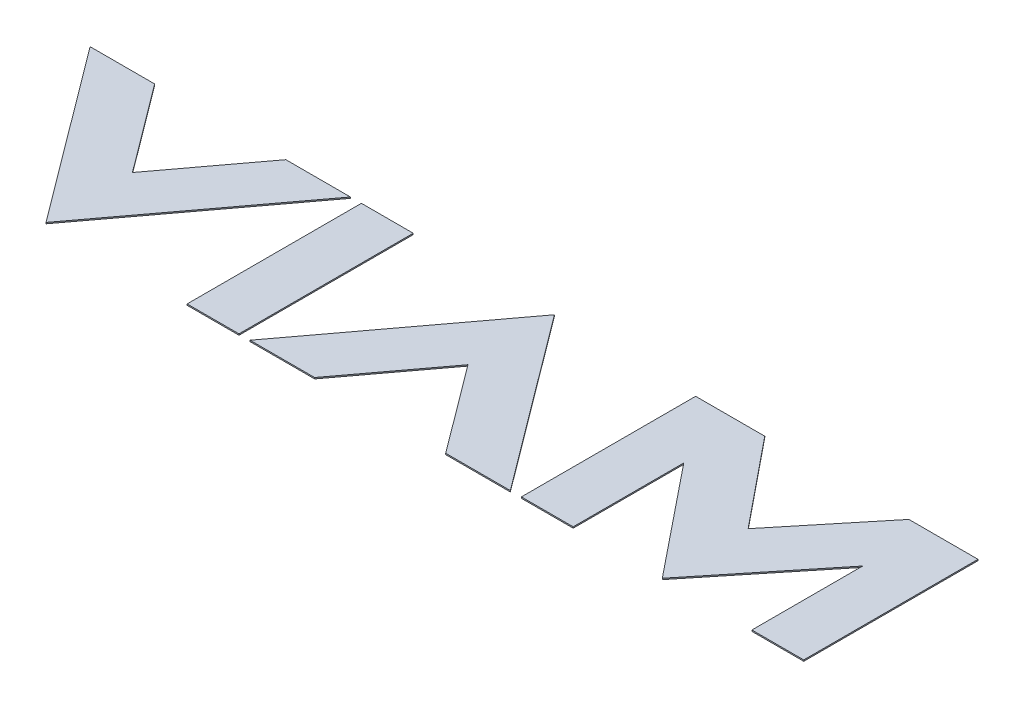
ISO-10303-21;
HEADER;
FILE_DESCRIPTION(('STEP AP214'),'2;1');
FILE_NAME('part.step','',(''),(''),'','','');
FILE_SCHEMA(('AUTOMOTIVE_DESIGN { 1 0 10303 214 1 1 1 1 }'));
ENDSEC;
DATA;
#1=APPLICATION_CONTEXT('core data for automotive mechanical design processes');
#2=APPLICATION_PROTOCOL_DEFINITION('international standard','automotive_design',2000,#1);
#3=PRODUCT_CONTEXT('',#1,'mechanical');
#4=PRODUCT('Part','Part','',(#3));
#5=PRODUCT_RELATED_PRODUCT_CATEGORY('part','',(#4));
#6=PRODUCT_DEFINITION_FORMATION('','',#4);
#7=PRODUCT_DEFINITION_CONTEXT('part definition',#1,'design');
#8=PRODUCT_DEFINITION('design','',#6,#7);
#9=PRODUCT_DEFINITION_SHAPE('','',#8);
#10=(LENGTH_UNIT() NAMED_UNIT(*) SI_UNIT(.MILLI.,.METRE.));
#11=(NAMED_UNIT(*) PLANE_ANGLE_UNIT() SI_UNIT($,.RADIAN.));
#12=(NAMED_UNIT(*) SI_UNIT($,.STERADIAN.) SOLID_ANGLE_UNIT());
#13=UNCERTAINTY_MEASURE_WITH_UNIT(LENGTH_MEASURE(1.E-05),#10,'distance_accuracy_value','');
#14=(GEOMETRIC_REPRESENTATION_CONTEXT(3) GLOBAL_UNCERTAINTY_ASSIGNED_CONTEXT((#13)) GLOBAL_UNIT_ASSIGNED_CONTEXT((#10,
#11,#12)) REPRESENTATION_CONTEXT('',''));
#15=CARTESIAN_POINT('',(0.,0.,0.));
#16=DIRECTION('',(0.,0.,1.));
#17=DIRECTION('',(1.,0.,0.));
#18=AXIS2_PLACEMENT_3D('',#15,#16,#17);
#19=CARTESIAN_POINT('',(11.7883153656796,0.1,6.73885035664306));
#20=DIRECTION('',(-0.801244842844147,0.,0.598336612464638));
#21=DIRECTION('',(0.598336612464638,0.,0.801244842844147));
#22=AXIS2_PLACEMENT_3D('',#19,#20,#21);
#23=PLANE('',#22);
#24=DIRECTION('',(-0.598336612464638,0.,-0.801244842844147));
#25=VECTOR('',#24,1.);
#26=CARTESIAN_POINT('',(11.7883153656796,0.,6.73885035664306));
#27=LINE('',#26,#25);
#28=CARTESIAN_POINT('',(11.7883153656796,0.,6.73885035664306));
#29=VERTEX_POINT('',#28);
#30=CARTESIAN_POINT('',(1.31660656567958,0.,-7.28402990335696));
#31=VERTEX_POINT('',#30);
#32=EDGE_CURVE('E144',#29,#31,#27,.T.);
#33=ORIENTED_EDGE('',*,*,#32,.T.);
#34=DIRECTION('',(0.,-1.,0.));
#35=VECTOR('',#34,1.);
#36=CARTESIAN_POINT('',(1.31660656567958,0.1,-7.28402990335696));
#37=LINE('',#36,#35);
#38=CARTESIAN_POINT('',(1.31660656567958,0.1,-7.28402990335696));
#39=VERTEX_POINT('',#38);
#40=EDGE_CURVE('E12',#39,#31,#37,.T.);
#41=ORIENTED_EDGE('',*,*,#40,.F.);
#42=DIRECTION('',(-0.598336612464638,0.,-0.801244842844147));
#43=VECTOR('',#42,1.);
#44=CARTESIAN_POINT('',(11.7883153656796,0.1,6.73885035664306));
#45=LINE('',#44,#43);
#46=CARTESIAN_POINT('',(11.7883153656796,0.1,6.73885035664306));
#47=VERTEX_POINT('',#46);
#48=EDGE_CURVE('E156',#47,#39,#45,.T.);
#49=ORIENTED_EDGE('',*,*,#48,.F.);
#50=DIRECTION('',(0.,-1.,0.));
#51=VECTOR('',#50,1.);
#52=CARTESIAN_POINT('',(11.7883153656796,0.1,6.73885035664306));
#53=LINE('',#52,#51);
#54=EDGE_CURVE('E140',#47,#29,#53,.T.);
#55=ORIENTED_EDGE('',*,*,#54,.T.);
#56=EDGE_LOOP('',(#33,#41,#49,#55));
#57=FACE_BOUND('',#56,.T.);
#58=ADVANCED_FACE('F49',(#57),#23,.F.);
#59=CARTESIAN_POINT('',(1.31660656567958,0.1,-7.28402990335696));
#60=DIRECTION('',(0.801160335078263,0.,0.598449761882553));
#61=DIRECTION('',(0.598449761882553,0.,-0.801160335078263));
#62=AXIS2_PLACEMENT_3D('',#59,#60,#61);
#63=PLANE('',#62);
#64=DIRECTION('',(-0.598449761882553,0.,0.801160335078263));
#65=VECTOR('',#64,1.);
#66=CARTESIAN_POINT('',(1.31660656567958,0.,-7.28402990335696));
#67=LINE('',#66,#65);
#68=CARTESIAN_POINT('',(-9.15510223432043,0.,6.73472031664306));
#69=VERTEX_POINT('',#68);
#70=EDGE_CURVE('E147',#31,#69,#67,.T.);
#71=ORIENTED_EDGE('',*,*,#70,.T.);
#72=DIRECTION('',(0.,-1.,0.));
#73=VECTOR('',#72,1.);
#74=CARTESIAN_POINT('',(-9.15510223432043,0.1,6.73472031664306));
#75=LINE('',#74,#73);
#76=CARTESIAN_POINT('',(-9.15510223432043,0.1,6.73472031664306));
#77=VERTEX_POINT('',#76);
#78=EDGE_CURVE('E57',#77,#69,#75,.T.);
#79=ORIENTED_EDGE('',*,*,#78,.F.);
#80=DIRECTION('',(-0.598449761882553,0.,0.801160335078263));
#81=VECTOR('',#80,1.);
#82=CARTESIAN_POINT('',(1.31660656567958,0.1,-7.28402990335696));
#83=LINE('',#82,#81);
#84=EDGE_CURVE('E105',#39,#77,#83,.T.);
#85=ORIENTED_EDGE('',*,*,#84,.F.);
#86=ORIENTED_EDGE('',*,*,#40,.T.);
#87=EDGE_LOOP('',(#71,#79,#85,#86));
#88=FACE_BOUND('',#87,.T.);
#89=ADVANCED_FACE('F183',(#88),#63,.F.);
#90=CARTESIAN_POINT('',(-9.15510223432043,0.1,6.73472031664306));
#91=DIRECTION('',(0.,0.,-1.));
#92=DIRECTION('',(-1.,0.,0.));
#93=AXIS2_PLACEMENT_3D('',#90,#91,#92);
#94=PLANE('',#93);
#95=DIRECTION('',(1.,0.,0.));
#96=VECTOR('',#95,1.);
#97=CARTESIAN_POINT('',(-9.15510223432043,0.,6.73472031664306));
#98=LINE('',#97,#96);
#99=CARTESIAN_POINT('',(-3.95856703432044,0.,6.73472031664306));
#100=VERTEX_POINT('',#99);
#101=EDGE_CURVE('E149',#69,#100,#98,.T.);
#102=ORIENTED_EDGE('',*,*,#101,.T.);
#103=DIRECTION('',(0.,-1.,0.));
#104=VECTOR('',#103,1.);
#105=CARTESIAN_POINT('',(-3.95856703432044,0.1,6.73472031664306));
#106=LINE('',#105,#104);
#107=CARTESIAN_POINT('',(-3.95856703432044,0.1,6.73472031664306));
#108=VERTEX_POINT('',#107);
#109=EDGE_CURVE('E132',#108,#100,#106,.T.);
#110=ORIENTED_EDGE('',*,*,#109,.F.);
#111=DIRECTION('',(1.,0.,0.));
#112=VECTOR('',#111,1.);
#113=CARTESIAN_POINT('',(-9.15510223432043,0.1,6.73472031664306));
#114=LINE('',#113,#112);
#115=EDGE_CURVE('E121',#77,#108,#114,.T.);
#116=ORIENTED_EDGE('',*,*,#115,.F.);
#117=ORIENTED_EDGE('',*,*,#78,.T.);
#118=EDGE_LOOP('',(#102,#110,#116,#117));
#119=FACE_BOUND('',#118,.T.);
#120=ADVANCED_FACE('F165',(#119),#94,.F.);
#121=CARTESIAN_POINT('',(-3.95856703432044,0.1,6.73472031664306));
#122=DIRECTION('',(-0.801122457843259,0.,-0.598500465780249));
#123=DIRECTION('',(-0.598500465780249,0.,0.801122457843259));
#124=AXIS2_PLACEMENT_3D('',#121,#122,#123);
#125=PLANE('',#124);
#126=DIRECTION('',(0.598500465780249,0.,-0.801122457843259));
#127=VECTOR('',#126,1.);
#128=CARTESIAN_POINT('',(-3.95856703432044,0.,6.73472031664306));
#129=LINE('',#128,#127);
#130=CARTESIAN_POINT('',(1.31660656567958,0.,-0.326360303356931));
#131=VERTEX_POINT('',#130);
#132=EDGE_CURVE('E130',#100,#131,#129,.T.);
#133=ORIENTED_EDGE('',*,*,#132,.T.);
#134=DIRECTION('',(0.,-1.,0.));
#135=VECTOR('',#134,1.);
#136=CARTESIAN_POINT('',(1.31660656567958,0.1,-0.326360303356931));
#137=LINE('',#136,#135);
#138=CARTESIAN_POINT('',(1.31660656567958,0.1,-0.326360303356931));
#139=VERTEX_POINT('',#138);
#140=EDGE_CURVE('E127',#139,#131,#137,.T.);
#141=ORIENTED_EDGE('',*,*,#140,.F.);
#142=DIRECTION('',(0.598500465780249,0.,-0.801122457843259));
#143=VECTOR('',#142,1.);
#144=CARTESIAN_POINT('',(-3.95856703432044,0.1,6.73472031664306));
#145=LINE('',#144,#143);
#146=EDGE_CURVE('E115',#108,#139,#145,.T.);
#147=ORIENTED_EDGE('',*,*,#146,.F.);
#148=ORIENTED_EDGE('',*,*,#109,.T.);
#149=EDGE_LOOP('',(#133,#141,#147,#148));
#150=FACE_BOUND('',#149,.T.);
#151=ADVANCED_FACE('F128',(#150),#125,.F.);
#152=CARTESIAN_POINT('',(1.31660656567958,0.1,-0.326360303356931));
#153=DIRECTION('',(0.801290209366539,0.,-0.598275856418532));
#154=DIRECTION('',(-0.598275856418532,0.,-0.801290209366539));
#155=AXIS2_PLACEMENT_3D('',#152,#153,#154);
#156=PLANE('',#155);
#157=DIRECTION('',(0.598275856418532,0.,0.801290209366539));
#158=VECTOR('',#157,1.);
#159=CARTESIAN_POINT('',(1.31660656567958,0.,-0.326360303356931));
#160=LINE('',#159,#158);
#161=CARTESIAN_POINT('',(6.59178016567957,0.,6.73885035664306));
#162=VERTEX_POINT('',#161);
#163=EDGE_CURVE('E91',#131,#162,#160,.T.);
#164=ORIENTED_EDGE('',*,*,#163,.T.);
#165=DIRECTION('',(0.,-1.,0.));
#166=VECTOR('',#165,1.);
#167=CARTESIAN_POINT('',(6.59178016567957,0.1,6.73885035664306));
#168=LINE('',#167,#166);
#169=CARTESIAN_POINT('',(6.59178016567957,0.1,6.73885035664306));
#170=VERTEX_POINT('',#169);
#171=EDGE_CURVE('E133',#170,#162,#168,.T.);
#172=ORIENTED_EDGE('',*,*,#171,.F.);
#173=DIRECTION('',(0.598275856418532,0.,0.801290209366539));
#174=VECTOR('',#173,1.);
#175=CARTESIAN_POINT('',(1.31660656567958,0.1,-0.326360303356931));
#176=LINE('',#175,#174);
#177=EDGE_CURVE('E119',#139,#170,#176,.T.);
#178=ORIENTED_EDGE('',*,*,#177,.F.);
#179=ORIENTED_EDGE('',*,*,#140,.T.);
#180=EDGE_LOOP('',(#164,#172,#178,#179));
#181=FACE_BOUND('',#180,.T.);
#182=ADVANCED_FACE('F135',(#181),#156,.F.);
#183=CARTESIAN_POINT('',(6.59178016567957,0.1,6.73885035664306));
#184=DIRECTION('',(0.,0.,-1.));
#185=DIRECTION('',(-1.,0.,0.));
#186=AXIS2_PLACEMENT_3D('',#183,#184,#185);
#187=PLANE('',#186);
#188=DIRECTION('',(1.,0.,0.));
#189=VECTOR('',#188,1.);
#190=CARTESIAN_POINT('',(6.59178016567957,0.,6.73885035664306));
#191=LINE('',#190,#189);
#192=EDGE_CURVE('E97',#162,#29,#191,.T.);
#193=ORIENTED_EDGE('',*,*,#192,.T.);
#194=ORIENTED_EDGE('',*,*,#54,.F.);
#195=DIRECTION('',(1.,0.,0.));
#196=VECTOR('',#195,1.);
#197=CARTESIAN_POINT('',(6.59178016567957,0.1,6.73885035664306));
#198=LINE('',#197,#196);
#199=EDGE_CURVE('E65',#170,#47,#198,.T.);
#200=ORIENTED_EDGE('',*,*,#199,.F.);
#201=ORIENTED_EDGE('',*,*,#171,.T.);
#202=EDGE_LOOP('',(#193,#194,#200,#201));
#203=FACE_BOUND('',#202,.T.);
#204=ADVANCED_FACE('F172',(#203),#187,.F.);
#205=CARTESIAN_POINT('',(0.,0.1,0.));
#206=DIRECTION('',(0.,-1.,0.));
#207=DIRECTION('',(0.,0.,-1.));
#208=AXIS2_PLACEMENT_3D('',#205,#206,#207);
#209=PLANE('',#208);
#210=ORIENTED_EDGE('',*,*,#48,.T.);
#211=ORIENTED_EDGE('',*,*,#84,.T.);
#212=ORIENTED_EDGE('',*,*,#115,.T.);
#213=ORIENTED_EDGE('',*,*,#146,.T.);
#214=ORIENTED_EDGE('',*,*,#177,.T.);
#215=ORIENTED_EDGE('',*,*,#199,.T.);
#216=EDGE_LOOP('',(#210,#211,#212,#213,#214,#215));
#217=FACE_BOUND('',#216,.T.);
#218=ADVANCED_FACE('F117',(#217),#209,.F.);
#219=CARTESIAN_POINT('',(0.,0.,0.));
#220=DIRECTION('',(0.,-1.,0.));
#221=DIRECTION('',(0.,0.,-1.));
#222=AXIS2_PLACEMENT_3D('',#219,#220,#221);
#223=PLANE('',#222);
#224=ORIENTED_EDGE('',*,*,#32,.F.);
#225=ORIENTED_EDGE('',*,*,#192,.F.);
#226=ORIENTED_EDGE('',*,*,#163,.F.);
#227=ORIENTED_EDGE('',*,*,#132,.F.);
#228=ORIENTED_EDGE('',*,*,#101,.F.);
#229=ORIENTED_EDGE('',*,*,#70,.F.);
#230=EDGE_LOOP('',(#224,#225,#226,#227,#228,#229));
#231=FACE_BOUND('',#230,.T.);
#232=ADVANCED_FACE('F168',(#231),#223,.T.);
#233=CLOSED_SHELL('',(#58,#89,#120,#151,#182,#204,#218,#232));
#234=MANIFOLD_SOLID_BREP('B2',#233);
#235=CARTESIAN_POINT('',(-15.0999214343204,0.1,-7.28402990335696));
#236=DIRECTION('',(0.,0.,1.));
#237=DIRECTION('',(1.,0.,0.));
#238=AXIS2_PLACEMENT_3D('',#235,#236,#237);
#239=PLANE('',#238);
#240=DIRECTION('',(-1.,0.,0.));
#241=VECTOR('',#240,1.);
#242=CARTESIAN_POINT('',(-15.0999214343204,0.,-7.28402990335696));
#243=LINE('',#242,#241);
#244=CARTESIAN_POINT('',(-15.0999214343204,0.,-7.28402990335696));
#245=VERTEX_POINT('',#244);
#246=CARTESIAN_POINT('',(-20.2966090343204,0.,-7.28402990335696));
#247=VERTEX_POINT('',#246);
#248=EDGE_CURVE('E343',#245,#247,#243,.T.);
#249=ORIENTED_EDGE('',*,*,#248,.T.);
#250=DIRECTION('',(0.,-1.,0.));
#251=VECTOR('',#250,1.);
#252=CARTESIAN_POINT('',(-20.2966090343204,0.1,-7.28402990335696));
#253=LINE('',#252,#251);
#254=CARTESIAN_POINT('',(-20.2966090343204,0.1,-7.28402990335696));
#255=VERTEX_POINT('',#254);
#256=EDGE_CURVE('E47',#255,#247,#253,.T.);
#257=ORIENTED_EDGE('',*,*,#256,.F.);
#258=DIRECTION('',(-1.,0.,0.));
#259=VECTOR('',#258,1.);
#260=CARTESIAN_POINT('',(-15.0999214343204,0.1,-7.28402990335696));
#261=LINE('',#260,#259);
#262=CARTESIAN_POINT('',(-15.0999214343204,0.1,-7.28402990335696));
#263=VERTEX_POINT('',#262);
#264=EDGE_CURVE('E357',#263,#255,#261,.T.);
#265=ORIENTED_EDGE('',*,*,#264,.F.);
#266=DIRECTION('',(0.,-1.,0.));
#267=VECTOR('',#266,1.);
#268=CARTESIAN_POINT('',(-15.0999214343204,0.1,-7.28402990335696));
#269=LINE('',#268,#267);
#270=EDGE_CURVE('E339',#263,#245,#269,.T.);
#271=ORIENTED_EDGE('',*,*,#270,.T.);
#272=EDGE_LOOP('',(#249,#257,#265,#271));
#273=FACE_BOUND('',#272,.T.);
#274=ADVANCED_FACE('F251',(#273),#239,.F.);
#275=CARTESIAN_POINT('',(-20.2966090343204,0.1,-7.28402990335696));
#276=DIRECTION('',(0.80129342434951,0.,0.598271550463697));
#277=DIRECTION('',(0.598271550463697,0.,-0.80129342434951));
#278=AXIS2_PLACEMENT_3D('',#275,#276,#277);
#279=PLANE('',#278);
#280=DIRECTION('',(-0.598271550463697,0.,0.80129342434951));
#281=VECTOR('',#280,1.);
#282=CARTESIAN_POINT('',(-20.2966090343204,0.,-7.28402990335696));
#283=LINE('',#282,#281);
#284=CARTESIAN_POINT('',(-25.5717064343204,0.,-0.218842103356952));
#285=VERTEX_POINT('',#284);
#286=EDGE_CURVE('E346',#247,#285,#283,.T.);
#287=ORIENTED_EDGE('',*,*,#286,.T.);
#288=DIRECTION('',(0.,-1.,0.));
#289=VECTOR('',#288,1.);
#290=CARTESIAN_POINT('',(-25.5717064343204,0.1,-0.218842103356952));
#291=LINE('',#290,#289);
#292=CARTESIAN_POINT('',(-25.5717064343204,0.1,-0.218842103356952));
#293=VERTEX_POINT('',#292);
#294=EDGE_CURVE('E259',#293,#285,#291,.T.);
#295=ORIENTED_EDGE('',*,*,#294,.F.);
#296=DIRECTION('',(-0.598271550463697,0.,0.80129342434951));
#297=VECTOR('',#296,1.);
#298=CARTESIAN_POINT('',(-20.2966090343204,0.1,-7.28402990335696));
#299=LINE('',#298,#297);
#300=EDGE_CURVE('E308',#255,#293,#299,.T.);
#301=ORIENTED_EDGE('',*,*,#300,.F.);
#302=ORIENTED_EDGE('',*,*,#256,.T.);
#303=EDGE_LOOP('',(#287,#295,#301,#302));
#304=FACE_BOUND('',#303,.T.);
#305=ADVANCED_FACE('F382',(#304),#279,.F.);
#306=CARTESIAN_POINT('',(-25.5717064343204,0.1,-0.218842103356952));
#307=DIRECTION('',(-0.801292181455901,0.,0.59827321512637));
#308=DIRECTION('',(0.59827321512637,0.,0.801292181455901));
#309=AXIS2_PLACEMENT_3D('',#306,#307,#308);
#310=PLANE('',#309);
#311=DIRECTION('',(-0.59827321512637,0.,-0.801292181455901));
#312=VECTOR('',#311,1.);
#313=CARTESIAN_POINT('',(-25.5717064343204,0.,-0.218842103356952));
#314=LINE('',#313,#312);
#315=CARTESIAN_POINT('',(-30.8468266943204,0.,-7.28402990335696));
#316=VERTEX_POINT('',#315);
#317=EDGE_CURVE('E348',#285,#316,#314,.T.);
#318=ORIENTED_EDGE('',*,*,#317,.T.);
#319=DIRECTION('',(0.,-1.,0.));
#320=VECTOR('',#319,1.);
#321=CARTESIAN_POINT('',(-30.8468266943204,0.1,-7.28402990335696));
#322=LINE('',#321,#320);
#323=CARTESIAN_POINT('',(-30.8468266943204,0.1,-7.28402990335696));
#324=VERTEX_POINT('',#323);
#325=EDGE_CURVE('E331',#324,#316,#322,.T.);
#326=ORIENTED_EDGE('',*,*,#325,.F.);
#327=DIRECTION('',(-0.59827321512637,0.,-0.801292181455901));
#328=VECTOR('',#327,1.);
#329=CARTESIAN_POINT('',(-25.5717064343204,0.1,-0.218842103356952));
#330=LINE('',#329,#328);
#331=EDGE_CURVE('E321',#293,#324,#330,.T.);
#332=ORIENTED_EDGE('',*,*,#331,.F.);
#333=ORIENTED_EDGE('',*,*,#294,.T.);
#334=EDGE_LOOP('',(#318,#326,#332,#333));
#335=FACE_BOUND('',#334,.T.);
#336=ADVANCED_FACE('F364',(#335),#310,.F.);
#337=CARTESIAN_POINT('',(-30.8468266943204,0.1,-7.28402990335696));
#338=DIRECTION('',(0.,0.,1.));
#339=DIRECTION('',(1.,0.,0.));
#340=AXIS2_PLACEMENT_3D('',#337,#338,#339);
#341=PLANE('',#340);
#342=DIRECTION('',(-1.,0.,0.));
#343=VECTOR('',#342,1.);
#344=CARTESIAN_POINT('',(-30.8468266943204,0.,-7.28402990335696));
#345=LINE('',#344,#343);
#346=CARTESIAN_POINT('',(-36.0434152343204,0.,-7.28402990335696));
#347=VERTEX_POINT('',#346);
#348=EDGE_CURVE('E330',#316,#347,#345,.T.);
#349=ORIENTED_EDGE('',*,*,#348,.T.);
#350=DIRECTION('',(0.,-1.,0.));
#351=VECTOR('',#350,1.);
#352=CARTESIAN_POINT('',(-36.0434152343204,0.1,-7.28402990335696));
#353=LINE('',#352,#351);
#354=CARTESIAN_POINT('',(-36.0434152343204,0.1,-7.28402990335696));
#355=VERTEX_POINT('',#354);
#356=EDGE_CURVE('E327',#355,#347,#353,.T.);
#357=ORIENTED_EDGE('',*,*,#356,.F.);
#358=DIRECTION('',(-1.,0.,0.));
#359=VECTOR('',#358,1.);
#360=CARTESIAN_POINT('',(-30.8468266943204,0.1,-7.28402990335696));
#361=LINE('',#360,#359);
#362=EDGE_CURVE('E315',#324,#355,#361,.T.);
#363=ORIENTED_EDGE('',*,*,#362,.F.);
#364=ORIENTED_EDGE('',*,*,#325,.T.);
#365=EDGE_LOOP('',(#349,#357,#363,#364));
#366=FACE_BOUND('',#365,.T.);
#367=ADVANCED_FACE('F328',(#366),#341,.F.);
#368=CARTESIAN_POINT('',(-36.0434152343204,0.1,-7.28402990335696));
#369=DIRECTION('',(0.801160335078263,0.,-0.598449761882553));
#370=DIRECTION('',(-0.598449761882553,0.,-0.801160335078263));
#371=AXIS2_PLACEMENT_3D('',#368,#369,#370);
#372=PLANE('',#371);
#373=DIRECTION('',(0.598449761882553,0.,0.801160335078263));
#374=VECTOR('',#373,1.);
#375=CARTESIAN_POINT('',(-36.0434152343204,0.,-7.28402990335696));
#376=LINE('',#375,#374);
#377=CARTESIAN_POINT('',(-25.5717064343204,0.,6.73472031664306));
#378=VERTEX_POINT('',#377);
#379=EDGE_CURVE('E294',#347,#378,#376,.T.);
#380=ORIENTED_EDGE('',*,*,#379,.T.);
#381=DIRECTION('',(0.,-1.,0.));
#382=VECTOR('',#381,1.);
#383=CARTESIAN_POINT('',(-25.5717064343204,0.1,6.73472031664306));
#384=LINE('',#383,#382);
#385=CARTESIAN_POINT('',(-25.5717064343204,0.1,6.73472031664306));
#386=VERTEX_POINT('',#385);
#387=EDGE_CURVE('E332',#386,#378,#384,.T.);
#388=ORIENTED_EDGE('',*,*,#387,.F.);
#389=DIRECTION('',(0.598449761882553,0.,0.801160335078263));
#390=VECTOR('',#389,1.);
#391=CARTESIAN_POINT('',(-36.0434152343204,0.1,-7.28402990335696));
#392=LINE('',#391,#390);
#393=EDGE_CURVE('E319',#355,#386,#392,.T.);
#394=ORIENTED_EDGE('',*,*,#393,.F.);
#395=ORIENTED_EDGE('',*,*,#356,.T.);
#396=EDGE_LOOP('',(#380,#388,#394,#395));
#397=FACE_BOUND('',#396,.T.);
#398=ADVANCED_FACE('F334',(#397),#372,.F.);
#399=CARTESIAN_POINT('',(-25.5717064343204,0.1,6.73472031664306));
#400=DIRECTION('',(-0.801158247166537,0.,-0.598452557014374));
#401=DIRECTION('',(-0.598452557014374,0.,0.801158247166537));
#402=AXIS2_PLACEMENT_3D('',#399,#400,#401);
#403=PLANE('',#402);
#404=DIRECTION('',(0.598452557014374,0.,-0.801158247166537));
#405=VECTOR('',#404,1.);
#406=CARTESIAN_POINT('',(-25.5717064343204,0.,6.73472031664306));
#407=LINE('',#406,#405);
#408=EDGE_CURVE('E300',#378,#245,#407,.T.);
#409=ORIENTED_EDGE('',*,*,#408,.T.);
#410=ORIENTED_EDGE('',*,*,#270,.F.);
#411=DIRECTION('',(0.598452557014374,0.,-0.801158247166537));
#412=VECTOR('',#411,1.);
#413=CARTESIAN_POINT('',(-25.5717064343204,0.1,6.73472031664306));
#414=LINE('',#413,#412);
#415=EDGE_CURVE('E267',#386,#263,#414,.T.);
#416=ORIENTED_EDGE('',*,*,#415,.F.);
#417=ORIENTED_EDGE('',*,*,#387,.T.);
#418=EDGE_LOOP('',(#409,#410,#416,#417));
#419=FACE_BOUND('',#418,.T.);
#420=ADVANCED_FACE('F371',(#419),#403,.F.);
#421=CARTESIAN_POINT('',(0.,0.1,0.));
#422=DIRECTION('',(0.,1.,0.));
#423=DIRECTION('',(0.,0.,1.));
#424=AXIS2_PLACEMENT_3D('',#421,#422,#423);
#425=PLANE('',#424);
#426=ORIENTED_EDGE('',*,*,#264,.T.);
#427=ORIENTED_EDGE('',*,*,#300,.T.);
#428=ORIENTED_EDGE('',*,*,#331,.T.);
#429=ORIENTED_EDGE('',*,*,#362,.T.);
#430=ORIENTED_EDGE('',*,*,#393,.T.);
#431=ORIENTED_EDGE('',*,*,#415,.T.);
#432=EDGE_LOOP('',(#426,#427,#428,#429,#430,#431));
#433=FACE_BOUND('',#432,.T.);
#434=ADVANCED_FACE('F317',(#433),#425,.T.);
#435=CARTESIAN_POINT('',(0.,0.,0.));
#436=DIRECTION('',(0.,1.,0.));
#437=DIRECTION('',(0.,0.,1.));
#438=AXIS2_PLACEMENT_3D('',#435,#436,#437);
#439=PLANE('',#438);
#440=ORIENTED_EDGE('',*,*,#248,.F.);
#441=ORIENTED_EDGE('',*,*,#408,.F.);
#442=ORIENTED_EDGE('',*,*,#379,.F.);
#443=ORIENTED_EDGE('',*,*,#348,.F.);
#444=ORIENTED_EDGE('',*,*,#317,.F.);
#445=ORIENTED_EDGE('',*,*,#286,.F.);
#446=EDGE_LOOP('',(#440,#441,#442,#443,#444,#445));
#447=FACE_BOUND('',#446,.T.);
#448=ADVANCED_FACE('F367',(#447),#439,.F.);
#449=CLOSED_SHELL('',(#274,#305,#336,#367,#398,#420,#434,#448));
#450=MANIFOLD_SOLID_BREP('B6',#449);
#451=CARTESIAN_POINT('',(35.3940847656796,0.1,-7.28402990335696));
#452=DIRECTION('',(0.,0.,1.));
#453=DIRECTION('',(1.,0.,0.));
#454=AXIS2_PLACEMENT_3D('',#451,#452,#453);
#455=PLANE('',#454);
#456=DIRECTION('',(-1.,0.,0.));
#457=VECTOR('',#456,1.);
#458=CARTESIAN_POINT('',(35.3940847656796,0.,-7.28402990335696));
#459=LINE('',#458,#457);
#460=CARTESIAN_POINT('',(35.3940847656796,0.,-7.28402990335696));
#461=VERTEX_POINT('',#460);
#462=CARTESIAN_POINT('',(29.8336945656796,0.,-7.28402990335696));
#463=VERTEX_POINT('',#462);
#464=EDGE_CURVE('E571',#461,#463,#459,.T.);
#465=ORIENTED_EDGE('',*,*,#464,.T.);
#466=DIRECTION('',(0.,-1.,0.));
#467=VECTOR('',#466,1.);
#468=CARTESIAN_POINT('',(29.8336945656796,0.1,-7.28402990335696));
#469=LINE('',#468,#467);
#470=CARTESIAN_POINT('',(29.8336945656796,0.1,-7.28402990335696));
#471=VERTEX_POINT('',#470);
#472=EDGE_CURVE('E249',#471,#463,#469,.T.);
#473=ORIENTED_EDGE('',*,*,#472,.F.);
#474=DIRECTION('',(-1.,0.,0.));
#475=VECTOR('',#474,1.);
#476=CARTESIAN_POINT('',(35.3940847656796,0.1,-7.28402990335696));
#477=LINE('',#476,#475);
#478=CARTESIAN_POINT('',(35.3940847656796,0.1,-7.28402990335696));
#479=VERTEX_POINT('',#478);
#480=EDGE_CURVE('E593',#479,#471,#477,.T.);
#481=ORIENTED_EDGE('',*,*,#480,.F.);
#482=DIRECTION('',(0.,-1.,0.));
#483=VECTOR('',#482,1.);
#484=CARTESIAN_POINT('',(35.3940847656796,0.1,-7.28402990335696));
#485=LINE('',#484,#483);
#486=EDGE_CURVE('E567',#479,#461,#485,.T.);
#487=ORIENTED_EDGE('',*,*,#486,.T.);
#488=EDGE_LOOP('',(#465,#473,#481,#487));
#489=FACE_BOUND('',#488,.T.);
#490=ADVANCED_FACE('F451',(#489),#455,.F.);
#491=CARTESIAN_POINT('',(29.8336945656796,0.1,-7.28402990335696));
#492=DIRECTION('',(0.773976134550616,0.,0.633214768578629));
#493=DIRECTION('',(0.633214768578629,0.,-0.773976134550616));
#494=AXIS2_PLACEMENT_3D('',#491,#492,#493);
#495=PLANE('',#494);
#496=DIRECTION('',(-0.633214768578629,0.,0.773976134550616));
#497=VECTOR('',#496,1.);
#498=CARTESIAN_POINT('',(29.8336945656796,0.,-7.28402990335696));
#499=LINE('',#498,#497);
#500=CARTESIAN_POINT('',(24.0128527656796,0.,-0.169235903356935));
#501=VERTEX_POINT('',#500);
#502=EDGE_CURVE('E574',#463,#501,#499,.T.);
#503=ORIENTED_EDGE('',*,*,#502,.T.);
#504=DIRECTION('',(0.,-1.,0.));
#505=VECTOR('',#504,1.);
#506=CARTESIAN_POINT('',(24.0128527656796,0.1,-0.169235903356935));
#507=LINE('',#506,#505);
#508=CARTESIAN_POINT('',(24.0128527656796,0.1,-0.169235903356935));
#509=VERTEX_POINT('',#508);
#510=EDGE_CURVE('E459',#509,#501,#507,.T.);
#511=ORIENTED_EDGE('',*,*,#510,.F.);
#512=DIRECTION('',(-0.633214768578629,0.,0.773976134550616));
#513=VECTOR('',#512,1.);
#514=CARTESIAN_POINT('',(29.8336945656796,0.1,-7.28402990335696));
#515=LINE('',#514,#513);
#516=EDGE_CURVE('E522',#471,#509,#515,.T.);
#517=ORIENTED_EDGE('',*,*,#516,.F.);
#518=ORIENTED_EDGE('',*,*,#472,.T.);
#519=EDGE_LOOP('',(#503,#511,#517,#518));
#520=FACE_BOUND('',#519,.T.);
#521=ADVANCED_FACE('F671',(#520),#495,.F.);
#522=CARTESIAN_POINT('',(24.0128527656796,0.1,-0.169235903356935));
#523=DIRECTION('',(-0.776407439323884,0.,0.630231297352432));
#524=DIRECTION('',(0.630231297352432,0.,0.776407439323884));
#525=AXIS2_PLACEMENT_3D('',#522,#523,#524);
#526=PLANE('',#525);
#527=DIRECTION('',(-0.630231297352432,0.,-0.776407439323884));
#528=VECTOR('',#527,1.);
#529=CARTESIAN_POINT('',(24.0128527656796,0.,-0.169235903356935));
#530=LINE('',#529,#528);
#531=CARTESIAN_POINT('',(18.2375785656796,0.,-7.28402990335696));
#532=VERTEX_POINT('',#531);
#533=EDGE_CURVE('E576',#501,#532,#530,.T.);
#534=ORIENTED_EDGE('',*,*,#533,.T.);
#535=DIRECTION('',(0.,-1.,0.));
#536=VECTOR('',#535,1.);
#537=CARTESIAN_POINT('',(18.2375785656796,0.1,-7.28402990335696));
#538=LINE('',#537,#536);
#539=CARTESIAN_POINT('',(18.2375785656796,0.1,-7.28402990335696));
#540=VERTEX_POINT('',#539);
#541=EDGE_CURVE('E612',#540,#532,#538,.T.);
#542=ORIENTED_EDGE('',*,*,#541,.F.);
#543=DIRECTION('',(-0.630231297352432,0.,-0.776407439323884));
#544=VECTOR('',#543,1.);
#545=CARTESIAN_POINT('',(24.0128527656796,0.1,-0.169235903356935));
#546=LINE('',#545,#544);
#547=EDGE_CURVE('E620',#509,#540,#546,.T.);
#548=ORIENTED_EDGE('',*,*,#547,.F.);
#549=ORIENTED_EDGE('',*,*,#510,.T.);
#550=EDGE_LOOP('',(#534,#542,#548,#549));
#551=FACE_BOUND('',#550,.T.);
#552=ADVANCED_FACE('F618',(#551),#526,.F.);
#553=CARTESIAN_POINT('',(18.2375785656796,0.1,-7.28402990335696));
#554=DIRECTION('',(0.,0.,1.));
#555=DIRECTION('',(1.,0.,0.));
#556=AXIS2_PLACEMENT_3D('',#553,#554,#555);
#557=PLANE('',#556);
#558=DIRECTION('',(-1.,0.,0.));
#559=VECTOR('',#558,1.);
#560=CARTESIAN_POINT('',(18.2375785656796,0.,-7.28402990335696));
#561=LINE('',#560,#559);
#562=CARTESIAN_POINT('',(12.6771883656796,0.,-7.28402990335696));
#563=VERTEX_POINT('',#562);
#564=EDGE_CURVE('E578',#532,#563,#561,.T.);
#565=ORIENTED_EDGE('',*,*,#564,.T.);
#566=DIRECTION('',(0.,-1.,0.));
#567=VECTOR('',#566,1.);
#568=CARTESIAN_POINT('',(12.6771883656796,0.1,-7.28402990335696));
#569=LINE('',#568,#567);
#570=CARTESIAN_POINT('',(12.6771883656796,0.1,-7.28402990335696));
#571=VERTEX_POINT('',#570);
#572=EDGE_CURVE('E609',#571,#563,#569,.T.);
#573=ORIENTED_EDGE('',*,*,#572,.F.);
#574=DIRECTION('',(-1.,0.,0.));
#575=VECTOR('',#574,1.);
#576=CARTESIAN_POINT('',(18.2375785656796,0.1,-7.28402990335696));
#577=LINE('',#576,#575);
#578=EDGE_CURVE('E638',#540,#571,#577,.T.);
#579=ORIENTED_EDGE('',*,*,#578,.F.);
#580=ORIENTED_EDGE('',*,*,#541,.T.);
#581=EDGE_LOOP('',(#565,#573,#579,#580));
#582=FACE_BOUND('',#581,.T.);
#583=ADVANCED_FACE('F629',(#582),#557,.F.);
#584=CARTESIAN_POINT('',(12.6771883656796,0.1,-7.28402990335696));
#585=DIRECTION('',(1.,0.,0.));
#586=DIRECTION('',(0.,0.,-1.));
#587=AXIS2_PLACEMENT_3D('',#584,#585,#586);
#588=PLANE('',#587);
#589=DIRECTION('',(0.,0.,1.));
#590=VECTOR('',#589,1.);
#591=CARTESIAN_POINT('',(12.6771883656796,0.,-7.28402990335696));
#592=LINE('',#591,#590);
#593=CARTESIAN_POINT('',(12.6771883656796,0.,6.73472031664306));
#594=VERTEX_POINT('',#593);
#595=EDGE_CURVE('E580',#563,#594,#592,.T.);
#596=ORIENTED_EDGE('',*,*,#595,.T.);
#597=DIRECTION('',(0.,-1.,0.));
#598=VECTOR('',#597,1.);
#599=CARTESIAN_POINT('',(12.6771883656796,0.1,6.73472031664306));
#600=LINE('',#599,#598);
#601=CARTESIAN_POINT('',(12.6771883656796,0.1,6.73472031664306));
#602=VERTEX_POINT('',#601);
#603=EDGE_CURVE('E606',#602,#594,#600,.T.);
#604=ORIENTED_EDGE('',*,*,#603,.F.);
#605=DIRECTION('',(0.,0.,1.));
#606=VECTOR('',#605,1.);
#607=CARTESIAN_POINT('',(12.6771883656796,0.1,-7.28402990335696));
#608=LINE('',#607,#606);
#609=EDGE_CURVE('E635',#571,#602,#608,.T.);
#610=ORIENTED_EDGE('',*,*,#609,.F.);
#611=ORIENTED_EDGE('',*,*,#572,.T.);
#612=EDGE_LOOP('',(#596,#604,#610,#611));
#613=FACE_BOUND('',#612,.T.);
#614=ADVANCED_FACE('F633',(#613),#588,.F.);
#615=CARTESIAN_POINT('',(12.6771883656796,0.1,6.73472031664306));
#616=DIRECTION('',(0.,0.,-1.));
#617=DIRECTION('',(-1.,0.,0.));
#618=AXIS2_PLACEMENT_3D('',#615,#616,#617);
#619=PLANE('',#618);
#620=DIRECTION('',(1.,0.,0.));
#621=VECTOR('',#620,1.);
#622=CARTESIAN_POINT('',(12.6771883656796,0.,6.73472031664306));
#623=LINE('',#622,#621);
#624=CARTESIAN_POINT('',(16.8443377656796,0.,6.73472031664306));
#625=VERTEX_POINT('',#624);
#626=EDGE_CURVE('E582',#594,#625,#623,.T.);
#627=ORIENTED_EDGE('',*,*,#626,.T.);
#628=DIRECTION('',(0.,-1.,0.));
#629=VECTOR('',#628,1.);
#630=CARTESIAN_POINT('',(16.8443377656796,0.1,6.73472031664306));
#631=LINE('',#630,#629);
#632=CARTESIAN_POINT('',(16.8443377656796,0.1,6.73472031664306));
#633=VERTEX_POINT('',#632);
#634=EDGE_CURVE('E603',#633,#625,#631,.T.);
#635=ORIENTED_EDGE('',*,*,#634,.F.);
#636=DIRECTION('',(1.,0.,0.));
#637=VECTOR('',#636,1.);
#638=CARTESIAN_POINT('',(12.6771883656796,0.1,6.73472031664306));
#639=LINE('',#638,#637);
#640=EDGE_CURVE('E637',#602,#633,#639,.T.);
#641=ORIENTED_EDGE('',*,*,#640,.F.);
#642=ORIENTED_EDGE('',*,*,#603,.T.);
#643=EDGE_LOOP('',(#627,#635,#641,#642));
#644=FACE_BOUND('',#643,.T.);
#645=ADVANCED_FACE('F684',(#644),#619,.F.);
#646=CARTESIAN_POINT('',(16.8443377656796,0.1,6.73472031664306));
#647=DIRECTION('',(-1.,0.,0.));
#648=DIRECTION('',(0.,0.,1.));
#649=AXIS2_PLACEMENT_3D('',#646,#647,#648);
#650=PLANE('',#649);
#651=DIRECTION('',(0.,0.,-1.));
#652=VECTOR('',#651,1.);
#653=CARTESIAN_POINT('',(16.8443377656796,0.,6.73472031664306));
#654=LINE('',#653,#652);
#655=CARTESIAN_POINT('',(16.8443377656796,0.,-2.16186590335696));
#656=VERTEX_POINT('',#655);
#657=EDGE_CURVE('E584',#625,#656,#654,.T.);
#658=ORIENTED_EDGE('',*,*,#657,.T.);
#659=DIRECTION('',(0.,-1.,0.));
#660=VECTOR('',#659,1.);
#661=CARTESIAN_POINT('',(16.8443377656796,0.1,-2.16186590335696));
#662=LINE('',#661,#660);
#663=CARTESIAN_POINT('',(16.8443377656796,0.1,-2.16186590335696));
#664=VERTEX_POINT('',#663);
#665=EDGE_CURVE('E600',#664,#656,#662,.T.);
#666=ORIENTED_EDGE('',*,*,#665,.F.);
#667=DIRECTION('',(0.,0.,-1.));
#668=VECTOR('',#667,1.);
#669=CARTESIAN_POINT('',(16.8443377656796,0.1,6.73472031664306));
#670=LINE('',#669,#668);
#671=EDGE_CURVE('E640',#633,#664,#670,.T.);
#672=ORIENTED_EDGE('',*,*,#671,.F.);
#673=ORIENTED_EDGE('',*,*,#634,.T.);
#674=EDGE_LOOP('',(#658,#666,#672,#673));
#675=FACE_BOUND('',#674,.T.);
#676=ADVANCED_FACE('F687',(#675),#650,.F.);
#677=CARTESIAN_POINT('',(16.8443377656796,0.1,-2.16186590335696));
#678=DIRECTION('',(0.778676058069398,0.,-0.627426168237748));
#679=DIRECTION('',(-0.627426168237748,0.,-0.778676058069398));
#680=AXIS2_PLACEMENT_3D('',#677,#678,#679);
#681=PLANE('',#680);
#682=DIRECTION('',(0.627426168237748,0.,0.778676058069398));
#683=VECTOR('',#682,1.);
#684=CARTESIAN_POINT('',(16.8443377656796,0.,-2.16186590335696));
#685=LINE('',#684,#683);
#686=CARTESIAN_POINT('',(24.0128527656796,0.,6.73472031664306));
#687=VERTEX_POINT('',#686);
#688=EDGE_CURVE('E586',#656,#687,#685,.T.);
#689=ORIENTED_EDGE('',*,*,#688,.T.);
#690=DIRECTION('',(0.,-1.,0.));
#691=VECTOR('',#690,1.);
#692=CARTESIAN_POINT('',(24.0128527656796,0.1,6.73472031664306));
#693=LINE('',#692,#691);
#694=CARTESIAN_POINT('',(24.0128527656796,0.1,6.73472031664306));
#695=VERTEX_POINT('',#694);
#696=EDGE_CURVE('E597',#695,#687,#693,.T.);
#697=ORIENTED_EDGE('',*,*,#696,.F.);
#698=DIRECTION('',(0.627426168237748,0.,0.778676058069398));
#699=VECTOR('',#698,1.);
#700=CARTESIAN_POINT('',(16.8443377656796,0.1,-2.16186590335696));
#701=LINE('',#700,#699);
#702=EDGE_CURVE('E646',#664,#695,#701,.T.);
#703=ORIENTED_EDGE('',*,*,#702,.F.);
#704=ORIENTED_EDGE('',*,*,#665,.T.);
#705=EDGE_LOOP('',(#689,#697,#703,#704));
#706=FACE_BOUND('',#705,.T.);
#707=ADVANCED_FACE('F652',(#706),#681,.F.);
#708=CARTESIAN_POINT('',(24.0128527656796,0.1,6.73472031664306));
#709=DIRECTION('',(-0.777623653734688,0.,-0.62873003201081));
#710=DIRECTION('',(-0.62873003201081,0.,0.777623653734688));
#711=AXIS2_PLACEMENT_3D('',#708,#709,#710);
#712=PLANE('',#711);
#713=DIRECTION('',(0.62873003201081,0.,-0.777623653734688));
#714=VECTOR('',#713,1.);
#715=CARTESIAN_POINT('',(24.0128527656796,0.,6.73472031664306));
#716=LINE('',#715,#714);
#717=CARTESIAN_POINT('',(31.2227443656796,0.,-2.18259230335694));
#718=VERTEX_POINT('',#717);
#719=EDGE_CURVE('E588',#687,#718,#716,.T.);
#720=ORIENTED_EDGE('',*,*,#719,.T.);
#721=DIRECTION('',(0.,-1.,0.));
#722=VECTOR('',#721,1.);
#723=CARTESIAN_POINT('',(31.2227443656796,0.1,-2.18259230335694));
#724=LINE('',#723,#722);
#725=CARTESIAN_POINT('',(31.2227443656796,0.1,-2.18259230335694));
#726=VERTEX_POINT('',#725);
#727=EDGE_CURVE('E562',#726,#718,#724,.T.);
#728=ORIENTED_EDGE('',*,*,#727,.F.);
#729=DIRECTION('',(0.62873003201081,0.,-0.777623653734688));
#730=VECTOR('',#729,1.);
#731=CARTESIAN_POINT('',(24.0128527656796,0.1,6.73472031664306));
#732=LINE('',#731,#730);
#733=EDGE_CURVE('E553',#695,#726,#732,.T.);
#734=ORIENTED_EDGE('',*,*,#733,.F.);
#735=ORIENTED_EDGE('',*,*,#696,.T.);
#736=EDGE_LOOP('',(#720,#728,#734,#735));
#737=FACE_BOUND('',#736,.T.);
#738=ADVANCED_FACE('F656',(#737),#712,.F.);
#739=CARTESIAN_POINT('',(31.2227443656796,0.1,-2.18259230335694));
#740=DIRECTION('',(1.,0.,0.));
#741=DIRECTION('',(0.,0.,-1.));
#742=AXIS2_PLACEMENT_3D('',#739,#740,#741);
#743=PLANE('',#742);
#744=DIRECTION('',(0.,0.,1.));
#745=VECTOR('',#744,1.);
#746=CARTESIAN_POINT('',(31.2227443656796,0.,-2.18259230335694));
#747=LINE('',#746,#745);
#748=CARTESIAN_POINT('',(31.2227443656796,0.,6.73472031664306));
#749=VERTEX_POINT('',#748);
#750=EDGE_CURVE('E561',#718,#749,#747,.T.);
#751=ORIENTED_EDGE('',*,*,#750,.T.);
#752=DIRECTION('',(0.,-1.,0.));
#753=VECTOR('',#752,1.);
#754=CARTESIAN_POINT('',(31.2227443656796,0.1,6.73472031664306));
#755=LINE('',#754,#753);
#756=CARTESIAN_POINT('',(31.2227443656796,0.1,6.73472031664306));
#757=VERTEX_POINT('',#756);
#758=EDGE_CURVE('E558',#757,#749,#755,.T.);
#759=ORIENTED_EDGE('',*,*,#758,.F.);
#760=DIRECTION('',(0.,0.,1.));
#761=VECTOR('',#760,1.);
#762=CARTESIAN_POINT('',(31.2227443656796,0.1,-2.18259230335694));
#763=LINE('',#762,#761);
#764=EDGE_CURVE('E547',#726,#757,#763,.T.);
#765=ORIENTED_EDGE('',*,*,#764,.F.);
#766=ORIENTED_EDGE('',*,*,#727,.T.);
#767=EDGE_LOOP('',(#751,#759,#765,#766));
#768=FACE_BOUND('',#767,.T.);
#769=ADVANCED_FACE('F559',(#768),#743,.F.);
#770=CARTESIAN_POINT('',(31.2227443656796,0.1,6.73472031664306));
#771=DIRECTION('',(0.,0.,-1.));
#772=DIRECTION('',(-1.,0.,0.));
#773=AXIS2_PLACEMENT_3D('',#770,#771,#772);
#774=PLANE('',#773);
#775=DIRECTION('',(1.,0.,0.));
#776=VECTOR('',#775,1.);
#777=CARTESIAN_POINT('',(31.2227443656796,0.,6.73472031664306));
#778=LINE('',#777,#776);
#779=CARTESIAN_POINT('',(35.3940847656796,0.,6.73472031664306));
#780=VERTEX_POINT('',#779);
#781=EDGE_CURVE('E508',#749,#780,#778,.T.);
#782=ORIENTED_EDGE('',*,*,#781,.T.);
#783=DIRECTION('',(0.,-1.,0.));
#784=VECTOR('',#783,1.);
#785=CARTESIAN_POINT('',(35.3940847656796,0.1,6.73472031664306));
#786=LINE('',#785,#784);
#787=CARTESIAN_POINT('',(35.3940847656796,0.1,6.73472031664306));
#788=VERTEX_POINT('',#787);
#789=EDGE_CURVE('E563',#788,#780,#786,.T.);
#790=ORIENTED_EDGE('',*,*,#789,.F.);
#791=DIRECTION('',(1.,0.,0.));
#792=VECTOR('',#791,1.);
#793=CARTESIAN_POINT('',(31.2227443656796,0.1,6.73472031664306));
#794=LINE('',#793,#792);
#795=EDGE_CURVE('E551',#757,#788,#794,.T.);
#796=ORIENTED_EDGE('',*,*,#795,.F.);
#797=ORIENTED_EDGE('',*,*,#758,.T.);
#798=EDGE_LOOP('',(#782,#790,#796,#797));
#799=FACE_BOUND('',#798,.T.);
#800=ADVANCED_FACE('F565',(#799),#774,.F.);
#801=CARTESIAN_POINT('',(35.3940847656796,0.1,6.73472031664306));
#802=DIRECTION('',(-1.,0.,0.));
#803=DIRECTION('',(0.,0.,1.));
#804=AXIS2_PLACEMENT_3D('',#801,#802,#803);
#805=PLANE('',#804);
#806=DIRECTION('',(0.,0.,-1.));
#807=VECTOR('',#806,1.);
#808=CARTESIAN_POINT('',(35.3940847656796,0.,6.73472031664306));
#809=LINE('',#808,#807);
#810=EDGE_CURVE('E514',#780,#461,#809,.T.);
#811=ORIENTED_EDGE('',*,*,#810,.T.);
#812=ORIENTED_EDGE('',*,*,#486,.F.);
#813=DIRECTION('',(0.,0.,-1.));
#814=VECTOR('',#813,1.);
#815=CARTESIAN_POINT('',(35.3940847656796,0.1,6.73472031664306));
#816=LINE('',#815,#814);
#817=EDGE_CURVE('E467',#788,#479,#816,.T.);
#818=ORIENTED_EDGE('',*,*,#817,.F.);
#819=ORIENTED_EDGE('',*,*,#789,.T.);
#820=EDGE_LOOP('',(#811,#812,#818,#819));
#821=FACE_BOUND('',#820,.T.);
#822=ADVANCED_FACE('F660',(#821),#805,.F.);
#823=CARTESIAN_POINT('',(0.,0.1,0.));
#824=DIRECTION('',(0.,1.,0.));
#825=DIRECTION('',(0.,0.,1.));
#826=AXIS2_PLACEMENT_3D('',#823,#824,#825);
#827=PLANE('',#826);
#828=ORIENTED_EDGE('',*,*,#480,.T.);
#829=ORIENTED_EDGE('',*,*,#516,.T.);
#830=ORIENTED_EDGE('',*,*,#547,.T.);
#831=ORIENTED_EDGE('',*,*,#578,.T.);
#832=ORIENTED_EDGE('',*,*,#609,.T.);
#833=ORIENTED_EDGE('',*,*,#640,.T.);
#834=ORIENTED_EDGE('',*,*,#671,.T.);
#835=ORIENTED_EDGE('',*,*,#702,.T.);
#836=ORIENTED_EDGE('',*,*,#733,.T.);
#837=ORIENTED_EDGE('',*,*,#764,.T.);
#838=ORIENTED_EDGE('',*,*,#795,.T.);
#839=ORIENTED_EDGE('',*,*,#817,.T.);
#840=EDGE_LOOP('',(#828,#829,#830,#831,#832,#833,#834,#835,#836,#837,#838,#839));
#841=FACE_BOUND('',#840,.T.);
#842=ADVANCED_FACE('F549',(#841),#827,.T.);
#843=CARTESIAN_POINT('',(0.,0.,0.));
#844=DIRECTION('',(0.,1.,0.));
#845=DIRECTION('',(0.,0.,1.));
#846=AXIS2_PLACEMENT_3D('',#843,#844,#845);
#847=PLANE('',#846);
#848=ORIENTED_EDGE('',*,*,#464,.F.);
#849=ORIENTED_EDGE('',*,*,#810,.F.);
#850=ORIENTED_EDGE('',*,*,#781,.F.);
#851=ORIENTED_EDGE('',*,*,#750,.F.);
#852=ORIENTED_EDGE('',*,*,#719,.F.);
#853=ORIENTED_EDGE('',*,*,#688,.F.);
#854=ORIENTED_EDGE('',*,*,#657,.F.);
#855=ORIENTED_EDGE('',*,*,#626,.F.);
#856=ORIENTED_EDGE('',*,*,#595,.F.);
#857=ORIENTED_EDGE('',*,*,#564,.F.);
#858=ORIENTED_EDGE('',*,*,#533,.F.);
#859=ORIENTED_EDGE('',*,*,#502,.F.);
#860=EDGE_LOOP('',(#848,#849,#850,#851,#852,#853,#854,#855,#856,#857,#858,#859));
#861=FACE_BOUND('',#860,.T.);
#862=ADVANCED_FACE('F624',(#861),#847,.F.);
#863=CLOSED_SHELL('',(#490,#521,#552,#583,#614,#645,#676,#707,#738,#769,#800,#822,#842,#862));
#864=MANIFOLD_SOLID_BREP('B41',#863);
#865=CARTESIAN_POINT('',(-14.2153156343204,0.1,6.73472031664306));
#866=DIRECTION('',(1.,0.,0.));
#867=DIRECTION('',(0.,0.,-1.));
#868=AXIS2_PLACEMENT_3D('',#865,#866,#867);
#869=PLANE('',#868);
#870=DIRECTION('',(0.,0.,1.));
#871=VECTOR('',#870,1.);
#872=CARTESIAN_POINT('',(-14.2153156343204,0.,6.73472031664306));
#873=LINE('',#872,#871);
#874=CARTESIAN_POINT('',(-14.2153156343204,0.,-7.28402990335696));
#875=VERTEX_POINT('',#874);
#876=CARTESIAN_POINT('',(-14.2153156343204,0.,6.73472031664306));
#877=VERTEX_POINT('',#876);
#878=EDGE_CURVE('E845',#875,#877,#873,.T.);
#879=ORIENTED_EDGE('',*,*,#878,.T.);
#880=DIRECTION('',(0.,-1.,0.));
#881=VECTOR('',#880,1.);
#882=CARTESIAN_POINT('',(-14.2153156343204,0.1,6.73472031664306));
#883=LINE('',#882,#881);
#884=CARTESIAN_POINT('',(-14.2153156343204,0.1,6.73472031664306));
#885=VERTEX_POINT('',#884);
#886=EDGE_CURVE('E449',#885,#877,#883,.T.);
#887=ORIENTED_EDGE('',*,*,#886,.F.);
#888=DIRECTION('',(0.,0.,1.));
#889=VECTOR('',#888,1.);
#890=CARTESIAN_POINT('',(-14.2153156343204,0.1,6.73472031664306));
#891=LINE('',#890,#889);
#892=CARTESIAN_POINT('',(-14.2153156343204,0.1,-7.28402990335696));
#893=VERTEX_POINT('',#892);
#894=EDGE_CURVE('E833',#893,#885,#891,.T.);
#895=ORIENTED_EDGE('',*,*,#894,.F.);
#896=DIRECTION('',(0.,-1.,0.));
#897=VECTOR('',#896,1.);
#898=CARTESIAN_POINT('',(-14.2153156343204,0.1,-7.28402990335696));
#899=LINE('',#898,#897);
#900=EDGE_CURVE('E841',#893,#875,#899,.T.);
#901=ORIENTED_EDGE('',*,*,#900,.T.);
#902=EDGE_LOOP('',(#879,#887,#895,#901));
#903=FACE_BOUND('',#902,.T.);
#904=ADVANCED_FACE('F782',(#903),#869,.F.);
#905=CARTESIAN_POINT('',(-10.0439752343204,0.1,6.73472031664306));
#906=DIRECTION('',(0.,0.,-1.));
#907=DIRECTION('',(-1.,0.,0.));
#908=AXIS2_PLACEMENT_3D('',#905,#906,#907);
#909=PLANE('',#908);
#910=DIRECTION('',(1.,0.,0.));
#911=VECTOR('',#910,1.);
#912=CARTESIAN_POINT('',(-10.0439752343204,0.,6.73472031664306));
#913=LINE('',#912,#911);
#914=CARTESIAN_POINT('',(-10.0439752343204,0.,6.73472031664306));
#915=VERTEX_POINT('',#914);
#916=EDGE_CURVE('E837',#877,#915,#913,.T.);
#917=ORIENTED_EDGE('',*,*,#916,.T.);
#918=DIRECTION('',(0.,-1.,0.));
#919=VECTOR('',#918,1.);
#920=CARTESIAN_POINT('',(-10.0439752343204,0.1,6.73472031664306));
#921=LINE('',#920,#919);
#922=CARTESIAN_POINT('',(-10.0439752343204,0.1,6.73472031664306));
#923=VERTEX_POINT('',#922);
#924=EDGE_CURVE('E790',#923,#915,#921,.T.);
#925=ORIENTED_EDGE('',*,*,#924,.F.);
#926=DIRECTION('',(1.,0.,0.));
#927=VECTOR('',#926,1.);
#928=CARTESIAN_POINT('',(-10.0439752343204,0.1,6.73472031664306));
#929=LINE('',#928,#927);
#930=EDGE_CURVE('E828',#885,#923,#929,.T.);
#931=ORIENTED_EDGE('',*,*,#930,.F.);
#932=ORIENTED_EDGE('',*,*,#886,.T.);
#933=EDGE_LOOP('',(#917,#925,#931,#932));
#934=FACE_BOUND('',#933,.T.);
#935=ADVANCED_FACE('F836',(#934),#909,.F.);
#936=CARTESIAN_POINT('',(-10.0439752343204,0.1,-7.28402990335696));
#937=DIRECTION('',(-1.,0.,0.));
#938=DIRECTION('',(0.,0.,1.));
#939=AXIS2_PLACEMENT_3D('',#936,#937,#938);
#940=PLANE('',#939);
#941=DIRECTION('',(0.,0.,-1.));
#942=VECTOR('',#941,1.);
#943=CARTESIAN_POINT('',(-10.0439752343204,0.,-7.28402990335696));
#944=LINE('',#943,#942);
#945=CARTESIAN_POINT('',(-10.0439752343204,0.,-7.28402990335696));
#946=VERTEX_POINT('',#945);
#947=EDGE_CURVE('E815',#915,#946,#944,.T.);
#948=ORIENTED_EDGE('',*,*,#947,.T.);
#949=DIRECTION('',(0.,-1.,0.));
#950=VECTOR('',#949,1.);
#951=CARTESIAN_POINT('',(-10.0439752343204,0.1,-7.28402990335696));
#952=LINE('',#951,#950);
#953=CARTESIAN_POINT('',(-10.0439752343204,0.1,-7.28402990335696));
#954=VERTEX_POINT('',#953);
#955=EDGE_CURVE('E838',#954,#946,#952,.T.);
#956=ORIENTED_EDGE('',*,*,#955,.F.);
#957=DIRECTION('',(0.,0.,-1.));
#958=VECTOR('',#957,1.);
#959=CARTESIAN_POINT('',(-10.0439752343204,0.1,-7.28402990335696));
#960=LINE('',#959,#958);
#961=EDGE_CURVE('E831',#923,#954,#960,.T.);
#962=ORIENTED_EDGE('',*,*,#961,.F.);
#963=ORIENTED_EDGE('',*,*,#924,.T.);
#964=EDGE_LOOP('',(#948,#956,#962,#963));
#965=FACE_BOUND('',#964,.T.);
#966=ADVANCED_FACE('F839',(#965),#940,.F.);
#967=CARTESIAN_POINT('',(-14.2153156343204,0.1,-7.28402990335696));
#968=DIRECTION('',(0.,0.,1.));
#969=DIRECTION('',(1.,0.,0.));
#970=AXIS2_PLACEMENT_3D('',#967,#968,#969);
#971=PLANE('',#970);
#972=DIRECTION('',(-1.,0.,0.));
#973=VECTOR('',#972,1.);
#974=CARTESIAN_POINT('',(-14.2153156343204,0.,-7.28402990335696));
#975=LINE('',#974,#973);
#976=EDGE_CURVE('E821',#946,#875,#975,.T.);
#977=ORIENTED_EDGE('',*,*,#976,.T.);
#978=ORIENTED_EDGE('',*,*,#900,.F.);
#979=DIRECTION('',(-1.,0.,0.));
#980=VECTOR('',#979,1.);
#981=CARTESIAN_POINT('',(-14.2153156343204,0.1,-7.28402990335696));
#982=LINE('',#981,#980);
#983=EDGE_CURVE('E798',#954,#893,#982,.T.);
#984=ORIENTED_EDGE('',*,*,#983,.F.);
#985=ORIENTED_EDGE('',*,*,#955,.T.);
#986=EDGE_LOOP('',(#977,#978,#984,#985));
#987=FACE_BOUND('',#986,.T.);
#988=ADVANCED_FACE('F852',(#987),#971,.F.);
#989=CARTESIAN_POINT('',(0.,0.1,0.));
#990=DIRECTION('',(0.,-1.,0.));
#991=DIRECTION('',(0.,0.,-1.));
#992=AXIS2_PLACEMENT_3D('',#989,#990,#991);
#993=PLANE('',#992);
#994=ORIENTED_EDGE('',*,*,#894,.T.);
#995=ORIENTED_EDGE('',*,*,#930,.T.);
#996=ORIENTED_EDGE('',*,*,#961,.T.);
#997=ORIENTED_EDGE('',*,*,#983,.T.);
#998=EDGE_LOOP('',(#994,#995,#996,#997));
#999=FACE_BOUND('',#998,.T.);
#1000=ADVANCED_FACE('F829',(#999),#993,.F.);
#1001=CARTESIAN_POINT('',(0.,0.,0.));
#1002=DIRECTION('',(0.,-1.,0.));
#1003=DIRECTION('',(0.,0.,-1.));
#1004=AXIS2_PLACEMENT_3D('',#1001,#1002,#1003);
#1005=PLANE('',#1004);
#1006=ORIENTED_EDGE('',*,*,#878,.F.);
#1007=ORIENTED_EDGE('',*,*,#976,.F.);
#1008=ORIENTED_EDGE('',*,*,#947,.F.);
#1009=ORIENTED_EDGE('',*,*,#916,.F.);
#1010=EDGE_LOOP('',(#1006,#1007,#1008,#1009));
#1011=FACE_BOUND('',#1010,.T.);
#1012=ADVANCED_FACE('F855',(#1011),#1005,.T.);
#1013=CLOSED_SHELL('',(#904,#935,#966,#988,#1000,#1012));
#1014=MANIFOLD_SOLID_BREP('B243',#1013);
#1015=ADVANCED_BREP_SHAPE_REPRESENTATION('',(#18,#234,#450,#864,#1014),#14);
#1016=SHAPE_DEFINITION_REPRESENTATION(#9,#1015);
ENDSEC;
END-ISO-10303-21;
